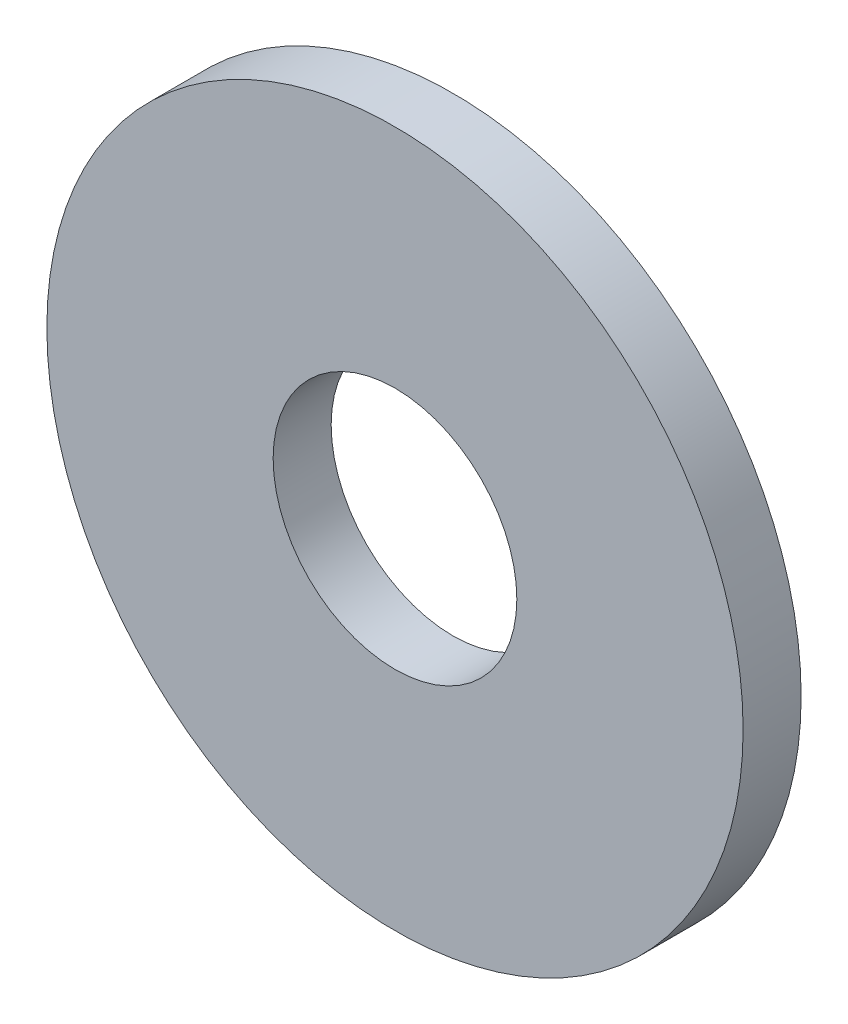
ISO-10303-21;
HEADER;
FILE_DESCRIPTION(('STEP AP214'),'2;1');
FILE_NAME('part.step','',(''),(''),'','','');
FILE_SCHEMA(('AUTOMOTIVE_DESIGN { 1 0 10303 214 1 1 1 1 }'));
ENDSEC;
DATA;
#1=APPLICATION_CONTEXT('core data for automotive mechanical design processes');
#2=APPLICATION_PROTOCOL_DEFINITION('international standard','automotive_design',2000,#1);
#3=PRODUCT_CONTEXT('',#1,'mechanical');
#4=PRODUCT('Part','Part','',(#3));
#5=PRODUCT_RELATED_PRODUCT_CATEGORY('part','',(#4));
#6=PRODUCT_DEFINITION_FORMATION('','',#4);
#7=PRODUCT_DEFINITION_CONTEXT('part definition',#1,'design');
#8=PRODUCT_DEFINITION('design','',#6,#7);
#9=PRODUCT_DEFINITION_SHAPE('','',#8);
#10=(LENGTH_UNIT() NAMED_UNIT(*) SI_UNIT(.MILLI.,.METRE.));
#11=(NAMED_UNIT(*) PLANE_ANGLE_UNIT() SI_UNIT($,.RADIAN.));
#12=(NAMED_UNIT(*) SI_UNIT($,.STERADIAN.) SOLID_ANGLE_UNIT());
#13=UNCERTAINTY_MEASURE_WITH_UNIT(LENGTH_MEASURE(1.E-05),#10,'distance_accuracy_value','');
#14=(GEOMETRIC_REPRESENTATION_CONTEXT(3) GLOBAL_UNCERTAINTY_ASSIGNED_CONTEXT((#13)) GLOBAL_UNIT_ASSIGNED_CONTEXT((#10,
#11,#12)) REPRESENTATION_CONTEXT('',''));
#15=CARTESIAN_POINT('',(0.,0.,0.));
#16=DIRECTION('',(0.,0.,1.));
#17=DIRECTION('',(1.,0.,0.));
#18=AXIS2_PLACEMENT_3D('',#15,#16,#17);
#19=CARTESIAN_POINT('',(0.,0.,2.));
#20=DIRECTION('',(0.,0.,1.));
#21=DIRECTION('',(1.,0.,0.));
#22=AXIS2_PLACEMENT_3D('',#19,#20,#21);
#23=PLANE('',#22);
#24=CARTESIAN_POINT('',(0.,0.,2.));
#25=DIRECTION('',(0.,0.,1.));
#26=DIRECTION('',(1.,0.,0.));
#27=AXIS2_PLACEMENT_3D('',#24,#25,#26);
#28=CIRCLE('',#27,12.);
#29=CARTESIAN_POINT('',(12.,0.,2.));
#30=VERTEX_POINT('',#29);
#31=EDGE_CURVE('E10',#30,#30,#28,.T.);
#32=ORIENTED_EDGE('',*,*,#31,.T.);
#33=EDGE_LOOP('',(#32));
#34=FACE_BOUND('',#33,.T.);
#35=CARTESIAN_POINT('',(0.,0.,2.));
#36=DIRECTION('',(0.,0.,1.));
#37=DIRECTION('',(1.,0.,0.));
#38=AXIS2_PLACEMENT_3D('',#35,#36,#37);
#39=CIRCLE('',#38,4.2);
#40=CARTESIAN_POINT('',(4.2,0.,2.));
#41=VERTEX_POINT('',#40);
#42=EDGE_CURVE('E43',#41,#41,#39,.T.);
#43=ORIENTED_EDGE('',*,*,#42,.F.);
#44=EDGE_LOOP('',(#43));
#45=FACE_BOUND('',#44,.T.);
#46=ADVANCED_FACE('F32',(#34,#45),#23,.T.);
#47=CARTESIAN_POINT('',(0.,0.,0.));
#48=DIRECTION('',(0.,0.,1.));
#49=DIRECTION('',(1.,0.,0.));
#50=AXIS2_PLACEMENT_3D('',#47,#48,#49);
#51=PLANE('',#50);
#52=CARTESIAN_POINT('',(0.,0.,0.));
#53=DIRECTION('',(0.,0.,1.));
#54=DIRECTION('',(1.,0.,0.));
#55=AXIS2_PLACEMENT_3D('',#52,#53,#54);
#56=CIRCLE('',#55,12.);
#57=CARTESIAN_POINT('',(12.,0.,0.));
#58=VERTEX_POINT('',#57);
#59=EDGE_CURVE('E36',#58,#58,#56,.T.);
#60=ORIENTED_EDGE('',*,*,#59,.F.);
#61=EDGE_LOOP('',(#60));
#62=FACE_BOUND('',#61,.T.);
#63=CARTESIAN_POINT('',(0.,0.,0.));
#64=DIRECTION('',(0.,0.,1.));
#65=DIRECTION('',(1.,0.,0.));
#66=AXIS2_PLACEMENT_3D('',#63,#64,#65);
#67=CIRCLE('',#66,4.2);
#68=CARTESIAN_POINT('',(4.2,0.,0.));
#69=VERTEX_POINT('',#68);
#70=EDGE_CURVE('E45',#69,#69,#67,.T.);
#71=ORIENTED_EDGE('',*,*,#70,.T.);
#72=EDGE_LOOP('',(#71));
#73=FACE_BOUND('',#72,.T.);
#74=ADVANCED_FACE('F55',(#62,#73),#51,.F.);
#75=CARTESIAN_POINT('',(0.,0.,2.));
#76=DIRECTION('',(0.,0.,-1.));
#77=DIRECTION('',(-1.,0.,0.));
#78=AXIS2_PLACEMENT_3D('',#75,#76,#77);
#79=CYLINDRICAL_SURFACE('',#78,12.);
#80=ORIENTED_EDGE('',*,*,#31,.F.);
#81=EDGE_LOOP('',(#80));
#82=FACE_BOUND('',#81,.T.);
#83=ORIENTED_EDGE('',*,*,#59,.T.);
#84=EDGE_LOOP('',(#83));
#85=FACE_BOUND('',#84,.T.);
#86=ADVANCED_FACE('F34',(#82,#85),#79,.T.);
#87=CARTESIAN_POINT('',(0.,0.,2.));
#88=DIRECTION('',(0.,0.,-1.));
#89=DIRECTION('',(-1.,0.,0.));
#90=AXIS2_PLACEMENT_3D('',#87,#88,#89);
#91=CYLINDRICAL_SURFACE('',#90,4.2);
#92=ORIENTED_EDGE('',*,*,#42,.T.);
#93=EDGE_LOOP('',(#92));
#94=FACE_BOUND('',#93,.T.);
#95=ORIENTED_EDGE('',*,*,#70,.F.);
#96=EDGE_LOOP('',(#95));
#97=FACE_BOUND('',#96,.T.);
#98=ADVANCED_FACE('F51',(#94,#97),#91,.F.);
#99=CLOSED_SHELL('',(#46,#74,#86,#98));
#100=MANIFOLD_SOLID_BREP('B2',#99);
#101=ADVANCED_BREP_SHAPE_REPRESENTATION('',(#18,#100),#14);
#102=SHAPE_DEFINITION_REPRESENTATION(#9,#101);
ENDSEC;
END-ISO-10303-21;
